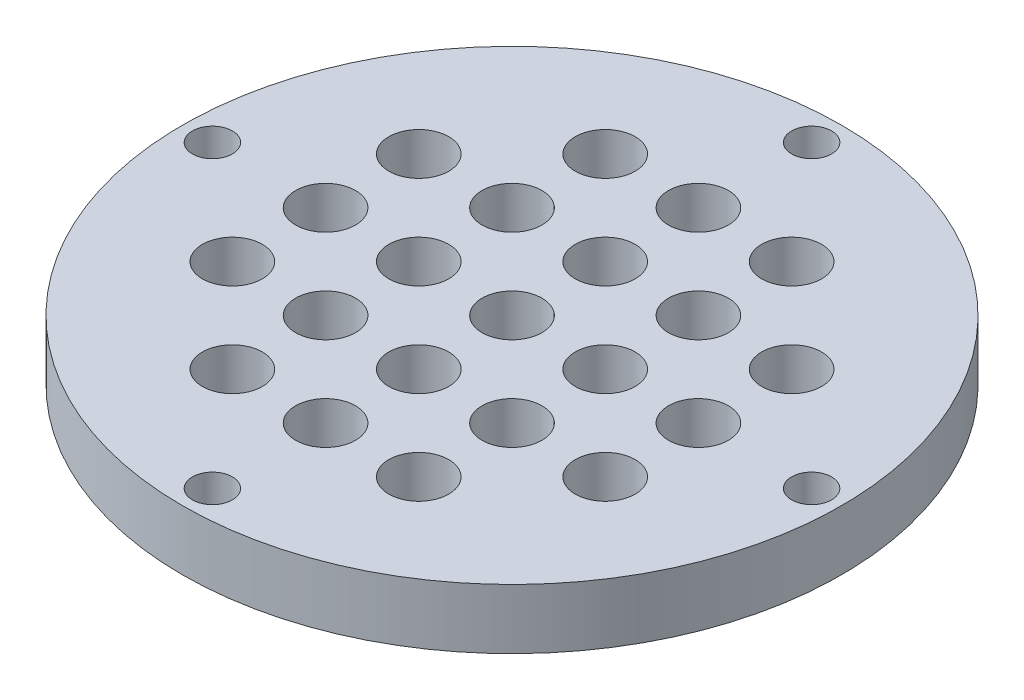
ISO-10303-21;
HEADER;
FILE_DESCRIPTION(('STEP AP214'),'2;1');
FILE_NAME('part.step','',(''),(''),'','','');
FILE_SCHEMA(('AUTOMOTIVE_DESIGN { 1 0 10303 214 1 1 1 1 }'));
ENDSEC;
DATA;
#1=APPLICATION_CONTEXT('core data for automotive mechanical design processes');
#2=APPLICATION_PROTOCOL_DEFINITION('international standard','automotive_design',2000,#1);
#3=PRODUCT_CONTEXT('',#1,'mechanical');
#4=PRODUCT('Part','Part','',(#3));
#5=PRODUCT_RELATED_PRODUCT_CATEGORY('part','',(#4));
#6=PRODUCT_DEFINITION_FORMATION('','',#4);
#7=PRODUCT_DEFINITION_CONTEXT('part definition',#1,'design');
#8=PRODUCT_DEFINITION('design','',#6,#7);
#9=PRODUCT_DEFINITION_SHAPE('','',#8);
#10=(LENGTH_UNIT() NAMED_UNIT(*) SI_UNIT(.MILLI.,.METRE.));
#11=(NAMED_UNIT(*) PLANE_ANGLE_UNIT() SI_UNIT($,.RADIAN.));
#12=(NAMED_UNIT(*) SI_UNIT($,.STERADIAN.) SOLID_ANGLE_UNIT());
#13=UNCERTAINTY_MEASURE_WITH_UNIT(LENGTH_MEASURE(1.E-05),#10,'distance_accuracy_value','');
#14=(GEOMETRIC_REPRESENTATION_CONTEXT(3) GLOBAL_UNCERTAINTY_ASSIGNED_CONTEXT((#13)) GLOBAL_UNIT_ASSIGNED_CONTEXT((#10,
#11,#12)) REPRESENTATION_CONTEXT('',''));
#15=CARTESIAN_POINT('',(0.,0.,0.));
#16=DIRECTION('',(0.,0.,1.));
#17=DIRECTION('',(1.,0.,0.));
#18=AXIS2_PLACEMENT_3D('',#15,#16,#17);
#19=CARTESIAN_POINT('',(0.,3.,0.));
#20=DIRECTION('',(0.,-1.,0.));
#21=DIRECTION('',(0.,0.,-1.));
#22=AXIS2_PLACEMENT_3D('',#19,#20,#21);
#23=CYLINDRICAL_SURFACE('',#22,16.5);
#24=CARTESIAN_POINT('',(0.,3.,0.));
#25=DIRECTION('',(0.,1.,0.));
#26=DIRECTION('',(0.,0.,1.));
#27=AXIS2_PLACEMENT_3D('',#24,#25,#26);
#28=CIRCLE('',#27,16.5);
#29=CARTESIAN_POINT('',(0.,3.,16.5));
#30=VERTEX_POINT('',#29);
#31=EDGE_CURVE('E11',#30,#30,#28,.T.);
#32=ORIENTED_EDGE('',*,*,#31,.F.);
#33=EDGE_LOOP('',(#32));
#34=FACE_BOUND('',#33,.T.);
#35=CARTESIAN_POINT('',(0.,0.,0.));
#36=DIRECTION('',(0.,1.,0.));
#37=DIRECTION('',(0.,0.,1.));
#38=AXIS2_PLACEMENT_3D('',#35,#36,#37);
#39=CIRCLE('',#38,16.5);
#40=CARTESIAN_POINT('',(0.,0.,16.5));
#41=VERTEX_POINT('',#40);
#42=EDGE_CURVE('E54',#41,#41,#39,.T.);
#43=ORIENTED_EDGE('',*,*,#42,.T.);
#44=EDGE_LOOP('',(#43));
#45=FACE_BOUND('',#44,.T.);
#46=ADVANCED_FACE('F47',(#34,#45),#23,.T.);
#47=CARTESIAN_POINT('',(0.,3.,0.));
#48=DIRECTION('',(0.,1.,0.));
#49=DIRECTION('',(0.,0.,1.));
#50=AXIS2_PLACEMENT_3D('',#47,#48,#49);
#51=PLANE('',#50);
#52=CARTESIAN_POINT('',(0.,3.,-9.33381288251492));
#53=DIRECTION('',(0.,1.,0.));
#54=DIRECTION('',(1.,0.,0.));
#55=AXIS2_PLACEMENT_3D('',#52,#53,#54);
#56=CIRCLE('',#55,1.5);
#57=CARTESIAN_POINT('',(1.49999999999998,3.,-9.33381288251492));
#58=VERTEX_POINT('',#57);
#59=EDGE_CURVE('E278',#58,#58,#56,.T.);
#60=ORIENTED_EDGE('',*,*,#59,.F.);
#61=EDGE_LOOP('',(#60));
#62=FACE_BOUND('',#61,.T.);
#63=CARTESIAN_POINT('',(4.66690475583122,3.,4.66690138497872));
#64=DIRECTION('',(0.,1.,0.));
#65=DIRECTION('',(1.,0.,0.));
#66=AXIS2_PLACEMENT_3D('',#63,#64,#65);
#67=CIRCLE('',#66,1.5);
#68=CARTESIAN_POINT('',(6.16690475583122,3.,4.66690138497872));
#69=VERTEX_POINT('',#68);
#70=EDGE_CURVE('E303',#69,#69,#67,.T.);
#71=ORIENTED_EDGE('',*,*,#70,.F.);
#72=EDGE_LOOP('',(#71));
#73=FACE_BOUND('',#72,.T.);
#74=CARTESIAN_POINT('',(-4.66690475583123,3.,-9.33381288251491));
#75=DIRECTION('',(0.,1.,0.));
#76=DIRECTION('',(1.,0.,0.));
#77=AXIS2_PLACEMENT_3D('',#74,#75,#76);
#78=CIRCLE('',#77,1.5);
#79=CARTESIAN_POINT('',(-3.16690475583123,3.,-9.33381288251491));
#80=VERTEX_POINT('',#79);
#81=EDGE_CURVE('E302',#80,#80,#78,.T.);
#82=ORIENTED_EDGE('',*,*,#81,.F.);
#83=EDGE_LOOP('',(#82));
#84=FACE_BOUND('',#83,.T.);
#85=CARTESIAN_POINT('',(4.66690475583121,3.,-3.37085249470237E-06));
#86=DIRECTION('',(0.,1.,0.));
#87=DIRECTION('',(1.,0.,0.));
#88=AXIS2_PLACEMENT_3D('',#85,#86,#87);
#89=CIRCLE('',#88,1.5);
#90=CARTESIAN_POINT('',(6.16690475583121,3.,-3.37085249470237E-06));
#91=VERTEX_POINT('',#90);
#92=EDGE_CURVE('E315',#91,#91,#89,.T.);
#93=ORIENTED_EDGE('',*,*,#92,.F.);
#94=EDGE_LOOP('',(#93));
#95=FACE_BOUND('',#94,.T.);
#96=CARTESIAN_POINT('',(0.,3.,4.66690138497873));
#97=DIRECTION('',(0.,1.,0.));
#98=DIRECTION('',(1.,0.,0.));
#99=AXIS2_PLACEMENT_3D('',#96,#97,#98);
#100=CIRCLE('',#99,1.5);
#101=CARTESIAN_POINT('',(1.50000000000001,3.,4.66690138497873));
#102=VERTEX_POINT('',#101);
#103=EDGE_CURVE('E279',#102,#102,#100,.T.);
#104=ORIENTED_EDGE('',*,*,#103,.F.);
#105=EDGE_LOOP('',(#104));
#106=FACE_BOUND('',#105,.T.);
#107=CARTESIAN_POINT('',(4.6669047558312,3.,-9.33381288251493));
#108=DIRECTION('',(0.,1.,0.));
#109=DIRECTION('',(1.,0.,0.));
#110=AXIS2_PLACEMENT_3D('',#107,#108,#109);
#111=CIRCLE('',#110,1.5);
#112=CARTESIAN_POINT('',(6.1669047558312,3.,-9.33381288251493));
#113=VERTEX_POINT('',#112);
#114=EDGE_CURVE('E285',#113,#113,#111,.T.);
#115=ORIENTED_EDGE('',*,*,#114,.F.);
#116=EDGE_LOOP('',(#115));
#117=FACE_BOUND('',#116,.T.);
#118=CARTESIAN_POINT('',(9.33380951166242,3.,-4.66690812668372));
#119=DIRECTION('',(0.,1.,0.));
#120=DIRECTION('',(1.,0.,0.));
#121=AXIS2_PLACEMENT_3D('',#118,#119,#120);
#122=CIRCLE('',#121,1.5);
#123=CARTESIAN_POINT('',(10.8338095116624,3.,-4.66690812668372));
#124=VERTEX_POINT('',#123);
#125=EDGE_CURVE('E291',#124,#124,#122,.T.);
#126=ORIENTED_EDGE('',*,*,#125,.F.);
#127=EDGE_LOOP('',(#126));
#128=FACE_BOUND('',#127,.T.);
#129=CARTESIAN_POINT('',(9.33380951166243,3.,-3.37085250337599E-06));
#130=DIRECTION('',(0.,1.,0.));
#131=DIRECTION('',(1.,0.,0.));
#132=AXIS2_PLACEMENT_3D('',#129,#130,#131);
#133=CIRCLE('',#132,1.5);
#134=CARTESIAN_POINT('',(10.8338095116624,3.,-3.37085250337599E-06));
#135=VERTEX_POINT('',#134);
#136=EDGE_CURVE('E255',#135,#135,#133,.T.);
#137=ORIENTED_EDGE('',*,*,#136,.F.);
#138=EDGE_LOOP('',(#137));
#139=FACE_BOUND('',#138,.T.);
#140=CARTESIAN_POINT('',(-4.66690475583122,3.,-4.66690812668369));
#141=DIRECTION('',(0.,1.,0.));
#142=DIRECTION('',(1.,0.,0.));
#143=AXIS2_PLACEMENT_3D('',#140,#141,#142);
#144=CIRCLE('',#143,1.5);
#145=CARTESIAN_POINT('',(-3.16690475583122,3.,-4.66690812668369));
#146=VERTEX_POINT('',#145);
#147=EDGE_CURVE('E338',#146,#146,#144,.T.);
#148=ORIENTED_EDGE('',*,*,#147,.F.);
#149=EDGE_LOOP('',(#148));
#150=FACE_BOUND('',#149,.T.);
#151=CARTESIAN_POINT('',(-9.33380951166242,3.,4.66690138497874));
#152=DIRECTION('',(0.,1.,0.));
#153=DIRECTION('',(1.,0.,0.));
#154=AXIS2_PLACEMENT_3D('',#151,#152,#153);
#155=CIRCLE('',#154,1.5);
#156=CARTESIAN_POINT('',(-7.83380951166242,3.,4.66690138497874));
#157=VERTEX_POINT('',#156);
#158=EDGE_CURVE('E351',#157,#157,#155,.T.);
#159=ORIENTED_EDGE('',*,*,#158,.F.);
#160=EDGE_LOOP('',(#159));
#161=FACE_BOUND('',#160,.T.);
#162=CARTESIAN_POINT('',(-4.66690475583121,3.,-3.3708524782225E-06));
#163=DIRECTION('',(0.,1.,0.));
#164=DIRECTION('',(1.,0.,0.));
#165=AXIS2_PLACEMENT_3D('',#162,#163,#164);
#166=CIRCLE('',#165,1.5);
#167=CARTESIAN_POINT('',(-3.16690475583121,3.,-3.3708524782225E-06));
#168=VERTEX_POINT('',#167);
#169=EDGE_CURVE('E350',#168,#168,#166,.T.);
#170=ORIENTED_EDGE('',*,*,#169,.F.);
#171=EDGE_LOOP('',(#170));
#172=FACE_BOUND('',#171,.T.);
#173=CARTESIAN_POINT('',(-4.66690475583121,3.,4.66690138497874));
#174=DIRECTION('',(0.,1.,0.));
#175=DIRECTION('',(1.,0.,0.));
#176=AXIS2_PLACEMENT_3D('',#173,#174,#175);
#177=CIRCLE('',#176,1.5);
#178=CARTESIAN_POINT('',(-3.16690475583121,3.,4.66690138497874));
#179=VERTEX_POINT('',#178);
#180=EDGE_CURVE('E363',#179,#179,#177,.T.);
#181=ORIENTED_EDGE('',*,*,#180,.F.);
#182=EDGE_LOOP('',(#181));
#183=FACE_BOUND('',#182,.T.);
#184=CARTESIAN_POINT('',(4.66690475583121,3.,-4.66690812668371));
#185=DIRECTION('',(0.,1.,0.));
#186=DIRECTION('',(1.,0.,0.));
#187=AXIS2_PLACEMENT_3D('',#184,#185,#186);
#188=CIRCLE('',#187,1.5);
#189=CARTESIAN_POINT('',(6.16690475583121,3.,-4.66690812668371));
#190=VERTEX_POINT('',#189);
#191=EDGE_CURVE('E314',#190,#190,#188,.T.);
#192=ORIENTED_EDGE('',*,*,#191,.F.);
#193=EDGE_LOOP('',(#192));
#194=FACE_BOUND('',#193,.T.);
#195=CARTESIAN_POINT('',(-9.33380951166243,3.,-4.66690812668368));
#196=DIRECTION('',(0.,1.,0.));
#197=DIRECTION('',(1.,0.,0.));
#198=AXIS2_PLACEMENT_3D('',#195,#196,#197);
#199=CIRCLE('',#198,1.5);
#200=CARTESIAN_POINT('',(-7.83380951166243,3.,-4.66690812668368));
#201=VERTEX_POINT('',#200);
#202=EDGE_CURVE('E327',#201,#201,#199,.T.);
#203=ORIENTED_EDGE('',*,*,#202,.F.);
#204=EDGE_LOOP('',(#203));
#205=FACE_BOUND('',#204,.T.);
#206=CARTESIAN_POINT('',(0.,3.,-4.6669081266837));
#207=DIRECTION('',(0.,1.,0.));
#208=DIRECTION('',(1.,0.,0.));
#209=AXIS2_PLACEMENT_3D('',#206,#207,#208);
#210=CIRCLE('',#209,1.5);
#211=CARTESIAN_POINT('',(1.49999999999999,3.,-4.6669081266837));
#212=VERTEX_POINT('',#211);
#213=EDGE_CURVE('E326',#212,#212,#210,.T.);
#214=ORIENTED_EDGE('',*,*,#213,.F.);
#215=EDGE_LOOP('',(#214));
#216=FACE_BOUND('',#215,.T.);
#217=CARTESIAN_POINT('',(-9.33380951166243,3.,-3.37085247041624E-06));
#218=DIRECTION('',(0.,1.,0.));
#219=DIRECTION('',(1.,0.,0.));
#220=AXIS2_PLACEMENT_3D('',#217,#218,#219);
#221=CIRCLE('',#220,1.5);
#222=CARTESIAN_POINT('',(-7.83380951166243,3.,-3.37085247041624E-06));
#223=VERTEX_POINT('',#222);
#224=EDGE_CURVE('E339',#223,#223,#221,.T.);
#225=ORIENTED_EDGE('',*,*,#224,.F.);
#226=EDGE_LOOP('',(#225));
#227=FACE_BOUND('',#226,.T.);
#228=CARTESIAN_POINT('',(9.33380951166244,3.,4.66690138497871));
#229=DIRECTION('',(0.,1.,0.));
#230=DIRECTION('',(1.,0.,0.));
#231=AXIS2_PLACEMENT_3D('',#228,#229,#230);
#232=CIRCLE('',#231,1.5);
#233=CARTESIAN_POINT('',(10.8338095116624,3.,4.66690138497871));
#234=VERTEX_POINT('',#233);
#235=EDGE_CURVE('E251',#234,#234,#232,.T.);
#236=ORIENTED_EDGE('',*,*,#235,.F.);
#237=EDGE_LOOP('',(#236));
#238=FACE_BOUND('',#237,.T.);
#239=CARTESIAN_POINT('',(4.66690475583123,3.,9.33380614080993));
#240=DIRECTION('',(0.,1.,0.));
#241=DIRECTION('',(1.,0.,0.));
#242=AXIS2_PLACEMENT_3D('',#239,#240,#241);
#243=CIRCLE('',#242,1.5);
#244=CARTESIAN_POINT('',(6.16690475583123,3.,9.33380614080993));
#245=VERTEX_POINT('',#244);
#246=EDGE_CURVE('E258',#245,#245,#243,.T.);
#247=ORIENTED_EDGE('',*,*,#246,.F.);
#248=EDGE_LOOP('',(#247));
#249=FACE_BOUND('',#248,.T.);
#250=CARTESIAN_POINT('',(0.,3.,9.33380614080994));
#251=DIRECTION('',(0.,1.,0.));
#252=DIRECTION('',(1.,0.,0.));
#253=AXIS2_PLACEMENT_3D('',#250,#251,#252);
#254=CIRCLE('',#253,1.5);
#255=CARTESIAN_POINT('',(1.50000000000002,3.,9.33380614080994));
#256=VERTEX_POINT('',#255);
#257=EDGE_CURVE('E266',#256,#256,#254,.T.);
#258=ORIENTED_EDGE('',*,*,#257,.F.);
#259=EDGE_LOOP('',(#258));
#260=FACE_BOUND('',#259,.T.);
#261=CARTESIAN_POINT('',(-4.6669047558312,3.,9.33380614080995));
#262=DIRECTION('',(0.,1.,0.));
#263=DIRECTION('',(1.,0.,0.));
#264=AXIS2_PLACEMENT_3D('',#261,#262,#263);
#265=CIRCLE('',#264,1.5);
#266=CARTESIAN_POINT('',(-3.1669047558312,3.,9.33380614080995));
#267=VERTEX_POINT('',#266);
#268=EDGE_CURVE('E272',#267,#267,#265,.T.);
#269=ORIENTED_EDGE('',*,*,#268,.F.);
#270=EDGE_LOOP('',(#269));
#271=FACE_BOUND('',#270,.T.);
#272=CARTESIAN_POINT('',(0.,3.,-3.37085248602875E-06));
#273=DIRECTION('',(0.,1.,0.));
#274=DIRECTION('',(1.,0.,0.));
#275=AXIS2_PLACEMENT_3D('',#272,#273,#274);
#276=CIRCLE('',#275,1.5);
#277=CARTESIAN_POINT('',(1.5,3.,-3.37085248602875E-06));
#278=VERTEX_POINT('',#277);
#279=EDGE_CURVE('E362',#278,#278,#276,.T.);
#280=ORIENTED_EDGE('',*,*,#279,.F.);
#281=EDGE_LOOP('',(#280));
#282=FACE_BOUND('',#281,.T.);
#283=CARTESIAN_POINT('',(0.,3.,15.));
#284=DIRECTION('',(0.,1.,0.));
#285=DIRECTION('',(-1.,0.,0.));
#286=AXIS2_PLACEMENT_3D('',#283,#284,#285);
#287=CIRCLE('',#286,1.);
#288=CARTESIAN_POINT('',(-1.00000000000006,3.,15.));
#289=VERTEX_POINT('',#288);
#290=EDGE_CURVE('E386',#289,#289,#287,.T.);
#291=ORIENTED_EDGE('',*,*,#290,.F.);
#292=EDGE_LOOP('',(#291));
#293=FACE_BOUND('',#292,.T.);
#294=CARTESIAN_POINT('',(-15.,3.,0.));
#295=DIRECTION('',(0.,1.,0.));
#296=DIRECTION('',(0.,0.,-1.));
#297=AXIS2_PLACEMENT_3D('',#294,#295,#296);
#298=CIRCLE('',#297,1.);
#299=CARTESIAN_POINT('',(-15.,3.,-1.));
#300=VERTEX_POINT('',#299);
#301=EDGE_CURVE('E86',#300,#300,#298,.T.);
#302=ORIENTED_EDGE('',*,*,#301,.F.);
#303=EDGE_LOOP('',(#302));
#304=FACE_BOUND('',#303,.T.);
#305=CARTESIAN_POINT('',(1.57116660247941E-13,3.,-15.));
#306=DIRECTION('',(0.,1.,0.));
#307=DIRECTION('',(1.,0.,0.));
#308=AXIS2_PLACEMENT_3D('',#305,#306,#307);
#309=CIRCLE('',#308,1.);
#310=CARTESIAN_POINT('',(1.00000000000016,3.,-15.));
#311=VERTEX_POINT('',#310);
#312=EDGE_CURVE('E77',#311,#311,#309,.T.);
#313=ORIENTED_EDGE('',*,*,#312,.F.);
#314=EDGE_LOOP('',(#313));
#315=FACE_BOUND('',#314,.T.);
#316=CARTESIAN_POINT('',(15.,3.,0.));
#317=DIRECTION('',(0.,1.,0.));
#318=DIRECTION('',(0.,0.,1.));
#319=AXIS2_PLACEMENT_3D('',#316,#317,#318);
#320=CIRCLE('',#319,1.);
#321=CARTESIAN_POINT('',(15.,3.,1.));
#322=VERTEX_POINT('',#321);
#323=EDGE_CURVE('E62',#322,#322,#320,.T.);
#324=ORIENTED_EDGE('',*,*,#323,.F.);
#325=EDGE_LOOP('',(#324));
#326=FACE_BOUND('',#325,.T.);
#327=ORIENTED_EDGE('',*,*,#31,.T.);
#328=EDGE_LOOP('',(#327));
#329=FACE_BOUND('',#328,.T.);
#330=ADVANCED_FACE('F100',(#62,#73,#84,#95,#106,#117,#128,#139,#150,#161,#172,#183,#194,#205,
#216,#227,#238,#249,#260,#271,#282,#293,#304,#315,#326,#329),#51,.T.);
#331=CARTESIAN_POINT('',(0.,0.,0.));
#332=DIRECTION('',(0.,1.,0.));
#333=DIRECTION('',(0.,0.,1.));
#334=AXIS2_PLACEMENT_3D('',#331,#332,#333);
#335=PLANE('',#334);
#336=CARTESIAN_POINT('',(0.,0.,-9.33381288251492));
#337=DIRECTION('',(0.,1.,0.));
#338=DIRECTION('',(1.,0.,0.));
#339=AXIS2_PLACEMENT_3D('',#336,#337,#338);
#340=CIRCLE('',#339,1.5);
#341=CARTESIAN_POINT('',(1.49999999999998,0.,-9.33381288251492));
#342=VERTEX_POINT('',#341);
#343=EDGE_CURVE('E306',#342,#342,#340,.T.);
#344=ORIENTED_EDGE('',*,*,#343,.T.);
#345=EDGE_LOOP('',(#344));
#346=FACE_BOUND('',#345,.T.);
#347=CARTESIAN_POINT('',(4.66690475583122,0.,4.66690138497872));
#348=DIRECTION('',(0.,1.,0.));
#349=DIRECTION('',(1.,0.,0.));
#350=AXIS2_PLACEMENT_3D('',#347,#348,#349);
#351=CIRCLE('',#350,1.5);
#352=CARTESIAN_POINT('',(6.16690475583122,0.,4.66690138497872));
#353=VERTEX_POINT('',#352);
#354=EDGE_CURVE('E299',#353,#353,#351,.T.);
#355=ORIENTED_EDGE('',*,*,#354,.T.);
#356=EDGE_LOOP('',(#355));
#357=FACE_BOUND('',#356,.T.);
#358=CARTESIAN_POINT('',(-4.66690475583123,0.,-9.33381288251491));
#359=DIRECTION('',(0.,1.,0.));
#360=DIRECTION('',(1.,0.,0.));
#361=AXIS2_PLACEMENT_3D('',#358,#359,#360);
#362=CIRCLE('',#361,1.5);
#363=CARTESIAN_POINT('',(-3.16690475583123,0.,-9.33381288251491));
#364=VERTEX_POINT('',#363);
#365=EDGE_CURVE('E318',#364,#364,#362,.T.);
#366=ORIENTED_EDGE('',*,*,#365,.T.);
#367=EDGE_LOOP('',(#366));
#368=FACE_BOUND('',#367,.T.);
#369=CARTESIAN_POINT('',(4.66690475583121,0.,-3.37085249470237E-06));
#370=DIRECTION('',(0.,1.,0.));
#371=DIRECTION('',(1.,0.,0.));
#372=AXIS2_PLACEMENT_3D('',#369,#370,#371);
#373=CIRCLE('',#372,1.5);
#374=CARTESIAN_POINT('',(6.16690475583121,0.,-3.37085249470237E-06));
#375=VERTEX_POINT('',#374);
#376=EDGE_CURVE('E311',#375,#375,#373,.T.);
#377=ORIENTED_EDGE('',*,*,#376,.T.);
#378=EDGE_LOOP('',(#377));
#379=FACE_BOUND('',#378,.T.);
#380=CARTESIAN_POINT('',(0.,0.,4.66690138497873));
#381=DIRECTION('',(0.,1.,0.));
#382=DIRECTION('',(1.,0.,0.));
#383=AXIS2_PLACEMENT_3D('',#380,#381,#382);
#384=CIRCLE('',#383,1.5);
#385=CARTESIAN_POINT('',(1.50000000000001,0.,4.66690138497873));
#386=VERTEX_POINT('',#385);
#387=EDGE_CURVE('E275',#386,#386,#384,.T.);
#388=ORIENTED_EDGE('',*,*,#387,.T.);
#389=EDGE_LOOP('',(#388));
#390=FACE_BOUND('',#389,.T.);
#391=CARTESIAN_POINT('',(4.6669047558312,0.,-9.33381288251493));
#392=DIRECTION('',(0.,1.,0.));
#393=DIRECTION('',(1.,0.,0.));
#394=AXIS2_PLACEMENT_3D('',#391,#392,#393);
#395=CIRCLE('',#394,1.5);
#396=CARTESIAN_POINT('',(6.1669047558312,0.,-9.33381288251493));
#397=VERTEX_POINT('',#396);
#398=EDGE_CURVE('E282',#397,#397,#395,.T.);
#399=ORIENTED_EDGE('',*,*,#398,.T.);
#400=EDGE_LOOP('',(#399));
#401=FACE_BOUND('',#400,.T.);
#402=CARTESIAN_POINT('',(9.33380951166242,0.,-4.66690812668372));
#403=DIRECTION('',(0.,1.,0.));
#404=DIRECTION('',(1.,0.,0.));
#405=AXIS2_PLACEMENT_3D('',#402,#403,#404);
#406=CIRCLE('',#405,1.5);
#407=CARTESIAN_POINT('',(10.8338095116624,0.,-4.66690812668372));
#408=VERTEX_POINT('',#407);
#409=EDGE_CURVE('E288',#408,#408,#406,.T.);
#410=ORIENTED_EDGE('',*,*,#409,.T.);
#411=EDGE_LOOP('',(#410));
#412=FACE_BOUND('',#411,.T.);
#413=CARTESIAN_POINT('',(9.33380951166243,0.,-3.37085250337599E-06));
#414=DIRECTION('',(0.,1.,0.));
#415=DIRECTION('',(1.,0.,0.));
#416=AXIS2_PLACEMENT_3D('',#413,#414,#415);
#417=CIRCLE('',#416,1.5);
#418=CARTESIAN_POINT('',(10.8338095116624,0.,-3.37085250337599E-06));
#419=VERTEX_POINT('',#418);
#420=EDGE_CURVE('E294',#419,#419,#417,.T.);
#421=ORIENTED_EDGE('',*,*,#420,.T.);
#422=EDGE_LOOP('',(#421));
#423=FACE_BOUND('',#422,.T.);
#424=CARTESIAN_POINT('',(-4.66690475583122,0.,-4.66690812668369));
#425=DIRECTION('',(0.,1.,0.));
#426=DIRECTION('',(1.,0.,0.));
#427=AXIS2_PLACEMENT_3D('',#424,#425,#426);
#428=CIRCLE('',#427,1.5);
#429=CARTESIAN_POINT('',(-3.16690475583122,0.,-4.66690812668369));
#430=VERTEX_POINT('',#429);
#431=EDGE_CURVE('E354',#430,#430,#428,.T.);
#432=ORIENTED_EDGE('',*,*,#431,.T.);
#433=EDGE_LOOP('',(#432));
#434=FACE_BOUND('',#433,.T.);
#435=CARTESIAN_POINT('',(-9.33380951166242,0.,4.66690138497874));
#436=DIRECTION('',(0.,1.,0.));
#437=DIRECTION('',(1.,0.,0.));
#438=AXIS2_PLACEMENT_3D('',#435,#436,#437);
#439=CIRCLE('',#438,1.5);
#440=CARTESIAN_POINT('',(-7.83380951166242,0.,4.66690138497874));
#441=VERTEX_POINT('',#440);
#442=EDGE_CURVE('E347',#441,#441,#439,.T.);
#443=ORIENTED_EDGE('',*,*,#442,.T.);
#444=EDGE_LOOP('',(#443));
#445=FACE_BOUND('',#444,.T.);
#446=CARTESIAN_POINT('',(-4.66690475583121,0.,-3.3708524782225E-06));
#447=DIRECTION('',(0.,1.,0.));
#448=DIRECTION('',(1.,0.,0.));
#449=AXIS2_PLACEMENT_3D('',#446,#447,#448);
#450=CIRCLE('',#449,1.5);
#451=CARTESIAN_POINT('',(-3.16690475583121,0.,-3.3708524782225E-06));
#452=VERTEX_POINT('',#451);
#453=EDGE_CURVE('E366',#452,#452,#450,.T.);
#454=ORIENTED_EDGE('',*,*,#453,.T.);
#455=EDGE_LOOP('',(#454));
#456=FACE_BOUND('',#455,.T.);
#457=CARTESIAN_POINT('',(-4.66690475583121,0.,4.66690138497874));
#458=DIRECTION('',(0.,1.,0.));
#459=DIRECTION('',(1.,0.,0.));
#460=AXIS2_PLACEMENT_3D('',#457,#458,#459);
#461=CIRCLE('',#460,1.5);
#462=CARTESIAN_POINT('',(-3.16690475583121,0.,4.66690138497874));
#463=VERTEX_POINT('',#462);
#464=EDGE_CURVE('E359',#463,#463,#461,.T.);
#465=ORIENTED_EDGE('',*,*,#464,.T.);
#466=EDGE_LOOP('',(#465));
#467=FACE_BOUND('',#466,.T.);
#468=CARTESIAN_POINT('',(4.66690475583121,0.,-4.66690812668371));
#469=DIRECTION('',(0.,1.,0.));
#470=DIRECTION('',(1.,0.,0.));
#471=AXIS2_PLACEMENT_3D('',#468,#469,#470);
#472=CIRCLE('',#471,1.5);
#473=CARTESIAN_POINT('',(6.16690475583121,0.,-4.66690812668371));
#474=VERTEX_POINT('',#473);
#475=EDGE_CURVE('E330',#474,#474,#472,.T.);
#476=ORIENTED_EDGE('',*,*,#475,.T.);
#477=EDGE_LOOP('',(#476));
#478=FACE_BOUND('',#477,.T.);
#479=CARTESIAN_POINT('',(-9.33380951166243,0.,-4.66690812668368));
#480=DIRECTION('',(0.,1.,0.));
#481=DIRECTION('',(1.,0.,0.));
#482=AXIS2_PLACEMENT_3D('',#479,#480,#481);
#483=CIRCLE('',#482,1.5);
#484=CARTESIAN_POINT('',(-7.83380951166243,0.,-4.66690812668368));
#485=VERTEX_POINT('',#484);
#486=EDGE_CURVE('E323',#485,#485,#483,.T.);
#487=ORIENTED_EDGE('',*,*,#486,.T.);
#488=EDGE_LOOP('',(#487));
#489=FACE_BOUND('',#488,.T.);
#490=CARTESIAN_POINT('',(0.,0.,-4.6669081266837));
#491=DIRECTION('',(0.,1.,0.));
#492=DIRECTION('',(1.,0.,0.));
#493=AXIS2_PLACEMENT_3D('',#490,#491,#492);
#494=CIRCLE('',#493,1.5);
#495=CARTESIAN_POINT('',(1.49999999999999,0.,-4.6669081266837));
#496=VERTEX_POINT('',#495);
#497=EDGE_CURVE('E342',#496,#496,#494,.T.);
#498=ORIENTED_EDGE('',*,*,#497,.T.);
#499=EDGE_LOOP('',(#498));
#500=FACE_BOUND('',#499,.T.);
#501=CARTESIAN_POINT('',(-9.33380951166243,0.,-3.37085247041624E-06));
#502=DIRECTION('',(0.,1.,0.));
#503=DIRECTION('',(1.,0.,0.));
#504=AXIS2_PLACEMENT_3D('',#501,#502,#503);
#505=CIRCLE('',#504,1.5);
#506=CARTESIAN_POINT('',(-7.83380951166243,0.,-3.37085247041624E-06));
#507=VERTEX_POINT('',#506);
#508=EDGE_CURVE('E335',#507,#507,#505,.T.);
#509=ORIENTED_EDGE('',*,*,#508,.T.);
#510=EDGE_LOOP('',(#509));
#511=FACE_BOUND('',#510,.T.);
#512=CARTESIAN_POINT('',(9.33380951166244,0.,4.66690138497871));
#513=DIRECTION('',(0.,1.,0.));
#514=DIRECTION('',(1.,0.,0.));
#515=AXIS2_PLACEMENT_3D('',#512,#513,#514);
#516=CIRCLE('',#515,1.5);
#517=CARTESIAN_POINT('',(10.8338095116624,0.,4.66690138497871));
#518=VERTEX_POINT('',#517);
#519=EDGE_CURVE('E248',#518,#518,#516,.T.);
#520=ORIENTED_EDGE('',*,*,#519,.T.);
#521=EDGE_LOOP('',(#520));
#522=FACE_BOUND('',#521,.T.);
#523=CARTESIAN_POINT('',(4.66690475583123,0.,9.33380614080993));
#524=DIRECTION('',(0.,1.,0.));
#525=DIRECTION('',(1.,0.,0.));
#526=AXIS2_PLACEMENT_3D('',#523,#524,#525);
#527=CIRCLE('',#526,1.5);
#528=CARTESIAN_POINT('',(6.16690475583123,0.,9.33380614080993));
#529=VERTEX_POINT('',#528);
#530=EDGE_CURVE('E253',#529,#529,#527,.T.);
#531=ORIENTED_EDGE('',*,*,#530,.T.);
#532=EDGE_LOOP('',(#531));
#533=FACE_BOUND('',#532,.T.);
#534=CARTESIAN_POINT('',(0.,0.,9.33380614080994));
#535=DIRECTION('',(0.,1.,0.));
#536=DIRECTION('',(1.,0.,0.));
#537=AXIS2_PLACEMENT_3D('',#534,#535,#536);
#538=CIRCLE('',#537,1.5);
#539=CARTESIAN_POINT('',(1.50000000000002,0.,9.33380614080994));
#540=VERTEX_POINT('',#539);
#541=EDGE_CURVE('E263',#540,#540,#538,.T.);
#542=ORIENTED_EDGE('',*,*,#541,.T.);
#543=EDGE_LOOP('',(#542));
#544=FACE_BOUND('',#543,.T.);
#545=CARTESIAN_POINT('',(-4.6669047558312,0.,9.33380614080995));
#546=DIRECTION('',(0.,1.,0.));
#547=DIRECTION('',(1.,0.,0.));
#548=AXIS2_PLACEMENT_3D('',#545,#546,#547);
#549=CIRCLE('',#548,1.5);
#550=CARTESIAN_POINT('',(-3.1669047558312,0.,9.33380614080995));
#551=VERTEX_POINT('',#550);
#552=EDGE_CURVE('E269',#551,#551,#549,.T.);
#553=ORIENTED_EDGE('',*,*,#552,.T.);
#554=EDGE_LOOP('',(#553));
#555=FACE_BOUND('',#554,.T.);
#556=CARTESIAN_POINT('',(0.,0.,-3.37085248602875E-06));
#557=DIRECTION('',(0.,1.,0.));
#558=DIRECTION('',(1.,0.,0.));
#559=AXIS2_PLACEMENT_3D('',#556,#557,#558);
#560=CIRCLE('',#559,1.5);
#561=CARTESIAN_POINT('',(1.5,0.,-3.37085248602875E-06));
#562=VERTEX_POINT('',#561);
#563=EDGE_CURVE('E371',#562,#562,#560,.T.);
#564=ORIENTED_EDGE('',*,*,#563,.T.);
#565=EDGE_LOOP('',(#564));
#566=FACE_BOUND('',#565,.T.);
#567=CARTESIAN_POINT('',(0.,0.,15.));
#568=DIRECTION('',(0.,1.,0.));
#569=DIRECTION('',(-1.,0.,0.));
#570=AXIS2_PLACEMENT_3D('',#567,#568,#569);
#571=CIRCLE('',#570,0.6);
#572=CARTESIAN_POINT('',(-0.600000000000052,0.,15.));
#573=VERTEX_POINT('',#572);
#574=EDGE_CURVE('E72',#573,#573,#571,.T.);
#575=ORIENTED_EDGE('',*,*,#574,.T.);
#576=EDGE_LOOP('',(#575));
#577=FACE_BOUND('',#576,.T.);
#578=CARTESIAN_POINT('',(-15.,0.,0.));
#579=DIRECTION('',(0.,1.,0.));
#580=DIRECTION('',(0.,0.,-1.));
#581=AXIS2_PLACEMENT_3D('',#578,#579,#580);
#582=CIRCLE('',#581,0.6);
#583=CARTESIAN_POINT('',(-15.,0.,-0.6));
#584=VERTEX_POINT('',#583);
#585=EDGE_CURVE('E379',#584,#584,#582,.T.);
#586=ORIENTED_EDGE('',*,*,#585,.T.);
#587=EDGE_LOOP('',(#586));
#588=FACE_BOUND('',#587,.T.);
#589=CARTESIAN_POINT('',(1.57116660247941E-13,0.,-15.));
#590=DIRECTION('',(0.,1.,0.));
#591=DIRECTION('',(1.,0.,0.));
#592=AXIS2_PLACEMENT_3D('',#589,#590,#591);
#593=CIRCLE('',#592,0.6);
#594=CARTESIAN_POINT('',(0.600000000000157,0.,-15.));
#595=VERTEX_POINT('',#594);
#596=EDGE_CURVE('E374',#595,#595,#593,.T.);
#597=ORIENTED_EDGE('',*,*,#596,.T.);
#598=EDGE_LOOP('',(#597));
#599=FACE_BOUND('',#598,.T.);
#600=CARTESIAN_POINT('',(15.,0.,0.));
#601=DIRECTION('',(0.,1.,0.));
#602=DIRECTION('',(0.,0.,1.));
#603=AXIS2_PLACEMENT_3D('',#600,#601,#602);
#604=CIRCLE('',#603,0.6);
#605=CARTESIAN_POINT('',(15.,0.,0.6));
#606=VERTEX_POINT('',#605);
#607=EDGE_CURVE('E68',#606,#606,#604,.T.);
#608=ORIENTED_EDGE('',*,*,#607,.T.);
#609=EDGE_LOOP('',(#608));
#610=FACE_BOUND('',#609,.T.);
#611=ORIENTED_EDGE('',*,*,#42,.F.);
#612=EDGE_LOOP('',(#611));
#613=FACE_BOUND('',#612,.T.);
#614=ADVANCED_FACE('F102',(#346,#357,#368,#379,#390,#401,#412,#423,#434,#445,#456,#467,#478,
#489,#500,#511,#522,#533,#544,#555,#566,#577,#588,#599,#610,#613),#335,.F.);
#615=CARTESIAN_POINT('',(15.,1.5,0.));
#616=DIRECTION('',(0.,1.,0.));
#617=DIRECTION('',(0.,0.,1.));
#618=AXIS2_PLACEMENT_3D('',#615,#616,#617);
#619=CYLINDRICAL_SURFACE('',#618,1.);
#620=CARTESIAN_POINT('',(15.,1.5,0.));
#621=DIRECTION('',(0.,1.,0.));
#622=DIRECTION('',(0.,0.,1.));
#623=AXIS2_PLACEMENT_3D('',#620,#621,#622);
#624=CIRCLE('',#623,1.);
#625=CARTESIAN_POINT('',(15.,1.5,1.));
#626=VERTEX_POINT('',#625);
#627=EDGE_CURVE('E59',#626,#626,#624,.T.);
#628=ORIENTED_EDGE('',*,*,#627,.F.);
#629=EDGE_LOOP('',(#628));
#630=FACE_BOUND('',#629,.T.);
#631=ORIENTED_EDGE('',*,*,#323,.T.);
#632=EDGE_LOOP('',(#631));
#633=FACE_BOUND('',#632,.T.);
#634=ADVANCED_FACE('F98',(#630,#633),#619,.F.);
#635=CARTESIAN_POINT('',(15.,1.5,0.));
#636=DIRECTION('',(0.,1.,0.));
#637=DIRECTION('',(0.,0.,1.));
#638=AXIS2_PLACEMENT_3D('',#635,#636,#637);
#639=PLANE('',#638);
#640=CARTESIAN_POINT('',(15.,1.5,0.));
#641=DIRECTION('',(0.,1.,0.));
#642=DIRECTION('',(0.,0.,1.));
#643=AXIS2_PLACEMENT_3D('',#640,#641,#642);
#644=CIRCLE('',#643,0.6);
#645=CARTESIAN_POINT('',(15.,1.5,0.6));
#646=VERTEX_POINT('',#645);
#647=EDGE_CURVE('E65',#646,#646,#644,.T.);
#648=ORIENTED_EDGE('',*,*,#647,.F.);
#649=EDGE_LOOP('',(#648));
#650=FACE_BOUND('',#649,.T.);
#651=ORIENTED_EDGE('',*,*,#627,.T.);
#652=EDGE_LOOP('',(#651));
#653=FACE_BOUND('',#652,.T.);
#654=ADVANCED_FACE('F117',(#650,#653),#639,.T.);
#655=CARTESIAN_POINT('',(15.,0.,0.));
#656=DIRECTION('',(0.,1.,0.));
#657=DIRECTION('',(0.,0.,1.));
#658=AXIS2_PLACEMENT_3D('',#655,#656,#657);
#659=CYLINDRICAL_SURFACE('',#658,0.6);
#660=ORIENTED_EDGE('',*,*,#647,.T.);
#661=EDGE_LOOP('',(#660));
#662=FACE_BOUND('',#661,.T.);
#663=ORIENTED_EDGE('',*,*,#607,.F.);
#664=EDGE_LOOP('',(#663));
#665=FACE_BOUND('',#664,.T.);
#666=ADVANCED_FACE('F121',(#662,#665),#659,.F.);
#667=CARTESIAN_POINT('',(1.57116660247941E-13,1.5,-15.));
#668=DIRECTION('',(0.,1.,0.));
#669=DIRECTION('',(0.,0.,1.));
#670=AXIS2_PLACEMENT_3D('',#667,#668,#669);
#671=CYLINDRICAL_SURFACE('',#670,1.);
#672=CARTESIAN_POINT('',(1.57116660247941E-13,1.5,-15.));
#673=DIRECTION('',(0.,1.,0.));
#674=DIRECTION('',(1.,0.,0.));
#675=AXIS2_PLACEMENT_3D('',#672,#673,#674);
#676=CIRCLE('',#675,1.);
#677=CARTESIAN_POINT('',(1.00000000000016,1.5,-15.));
#678=VERTEX_POINT('',#677);
#679=EDGE_CURVE('E81',#678,#678,#676,.T.);
#680=ORIENTED_EDGE('',*,*,#679,.F.);
#681=EDGE_LOOP('',(#680));
#682=FACE_BOUND('',#681,.T.);
#683=ORIENTED_EDGE('',*,*,#312,.T.);
#684=EDGE_LOOP('',(#683));
#685=FACE_BOUND('',#684,.T.);
#686=ADVANCED_FACE('F125',(#682,#685),#671,.F.);
#687=CARTESIAN_POINT('',(1.57116660247941E-13,1.5,-15.));
#688=DIRECTION('',(0.,1.,0.));
#689=DIRECTION('',(1.,0.,0.));
#690=AXIS2_PLACEMENT_3D('',#687,#688,#689);
#691=PLANE('',#690);
#692=CARTESIAN_POINT('',(1.57116660247941E-13,1.5,-15.));
#693=DIRECTION('',(0.,1.,0.));
#694=DIRECTION('',(0.,0.,1.));
#695=AXIS2_PLACEMENT_3D('',#692,#693,#694);
#696=CIRCLE('',#695,0.6);
#697=CARTESIAN_POINT('',(1.57116660247941E-13,1.5,-14.4));
#698=VERTEX_POINT('',#697);
#699=EDGE_CURVE('E50',#698,#698,#696,.T.);
#700=ORIENTED_EDGE('',*,*,#699,.F.);
#701=EDGE_LOOP('',(#700));
#702=FACE_BOUND('',#701,.T.);
#703=ORIENTED_EDGE('',*,*,#679,.T.);
#704=EDGE_LOOP('',(#703));
#705=FACE_BOUND('',#704,.T.);
#706=ADVANCED_FACE('F129',(#702,#705),#691,.T.);
#707=CARTESIAN_POINT('',(-15.,1.5,0.));
#708=DIRECTION('',(0.,1.,0.));
#709=DIRECTION('',(0.,0.,1.));
#710=AXIS2_PLACEMENT_3D('',#707,#708,#709);
#711=CYLINDRICAL_SURFACE('',#710,1.);
#712=CARTESIAN_POINT('',(-15.,1.5,0.));
#713=DIRECTION('',(0.,1.,0.));
#714=DIRECTION('',(0.,0.,-1.));
#715=AXIS2_PLACEMENT_3D('',#712,#713,#714);
#716=CIRCLE('',#715,1.);
#717=CARTESIAN_POINT('',(-15.,1.5,-1.));
#718=VERTEX_POINT('',#717);
#719=EDGE_CURVE('E389',#718,#718,#716,.T.);
#720=ORIENTED_EDGE('',*,*,#719,.F.);
#721=EDGE_LOOP('',(#720));
#722=FACE_BOUND('',#721,.T.);
#723=ORIENTED_EDGE('',*,*,#301,.T.);
#724=EDGE_LOOP('',(#723));
#725=FACE_BOUND('',#724,.T.);
#726=ADVANCED_FACE('F133',(#722,#725),#711,.F.);
#727=CARTESIAN_POINT('',(-15.,1.5,0.));
#728=DIRECTION('',(0.,1.,0.));
#729=DIRECTION('',(0.,0.,-1.));
#730=AXIS2_PLACEMENT_3D('',#727,#728,#729);
#731=PLANE('',#730);
#732=CARTESIAN_POINT('',(-15.,1.5,0.));
#733=DIRECTION('',(0.,1.,0.));
#734=DIRECTION('',(0.,0.,1.));
#735=AXIS2_PLACEMENT_3D('',#732,#733,#734);
#736=CIRCLE('',#735,0.6);
#737=CARTESIAN_POINT('',(-15.,1.5,0.6));
#738=VERTEX_POINT('',#737);
#739=EDGE_CURVE('E71',#738,#738,#736,.T.);
#740=ORIENTED_EDGE('',*,*,#739,.F.);
#741=EDGE_LOOP('',(#740));
#742=FACE_BOUND('',#741,.T.);
#743=ORIENTED_EDGE('',*,*,#719,.T.);
#744=EDGE_LOOP('',(#743));
#745=FACE_BOUND('',#744,.T.);
#746=ADVANCED_FACE('F137',(#742,#745),#731,.T.);
#747=CARTESIAN_POINT('',(0.,1.5,15.));
#748=DIRECTION('',(0.,1.,0.));
#749=DIRECTION('',(0.,0.,1.));
#750=AXIS2_PLACEMENT_3D('',#747,#748,#749);
#751=CYLINDRICAL_SURFACE('',#750,1.);
#752=CARTESIAN_POINT('',(0.,1.5,15.));
#753=DIRECTION('',(0.,1.,0.));
#754=DIRECTION('',(-1.,0.,0.));
#755=AXIS2_PLACEMENT_3D('',#752,#753,#754);
#756=CIRCLE('',#755,1.);
#757=CARTESIAN_POINT('',(-1.00000000000006,1.5,15.));
#758=VERTEX_POINT('',#757);
#759=EDGE_CURVE('E91',#758,#758,#756,.T.);
#760=ORIENTED_EDGE('',*,*,#759,.F.);
#761=EDGE_LOOP('',(#760));
#762=FACE_BOUND('',#761,.T.);
#763=ORIENTED_EDGE('',*,*,#290,.T.);
#764=EDGE_LOOP('',(#763));
#765=FACE_BOUND('',#764,.T.);
#766=ADVANCED_FACE('F141',(#762,#765),#751,.F.);
#767=CARTESIAN_POINT('',(0.,1.5,15.));
#768=DIRECTION('',(0.,1.,0.));
#769=DIRECTION('',(-1.,0.,0.));
#770=AXIS2_PLACEMENT_3D('',#767,#768,#769);
#771=PLANE('',#770);
#772=CARTESIAN_POINT('',(0.,1.5,15.));
#773=DIRECTION('',(0.,1.,0.));
#774=DIRECTION('',(0.,0.,1.));
#775=AXIS2_PLACEMENT_3D('',#772,#773,#774);
#776=CIRCLE('',#775,0.6);
#777=CARTESIAN_POINT('',(0.,1.5,15.6));
#778=VERTEX_POINT('',#777);
#779=EDGE_CURVE('E69',#778,#778,#776,.T.);
#780=ORIENTED_EDGE('',*,*,#779,.F.);
#781=EDGE_LOOP('',(#780));
#782=FACE_BOUND('',#781,.T.);
#783=ORIENTED_EDGE('',*,*,#759,.T.);
#784=EDGE_LOOP('',(#783));
#785=FACE_BOUND('',#784,.T.);
#786=ADVANCED_FACE('F145',(#782,#785),#771,.T.);
#787=CARTESIAN_POINT('',(0.,0.,15.));
#788=DIRECTION('',(0.,1.,0.));
#789=DIRECTION('',(0.,0.,1.));
#790=AXIS2_PLACEMENT_3D('',#787,#788,#789);
#791=CYLINDRICAL_SURFACE('',#790,0.6);
#792=ORIENTED_EDGE('',*,*,#779,.T.);
#793=EDGE_LOOP('',(#792));
#794=FACE_BOUND('',#793,.T.);
#795=ORIENTED_EDGE('',*,*,#574,.F.);
#796=EDGE_LOOP('',(#795));
#797=FACE_BOUND('',#796,.T.);
#798=ADVANCED_FACE('F149',(#794,#797),#791,.F.);
#799=CARTESIAN_POINT('',(-15.,0.,0.));
#800=DIRECTION('',(0.,1.,0.));
#801=DIRECTION('',(0.,0.,1.));
#802=AXIS2_PLACEMENT_3D('',#799,#800,#801);
#803=CYLINDRICAL_SURFACE('',#802,0.6);
#804=ORIENTED_EDGE('',*,*,#739,.T.);
#805=EDGE_LOOP('',(#804));
#806=FACE_BOUND('',#805,.T.);
#807=ORIENTED_EDGE('',*,*,#585,.F.);
#808=EDGE_LOOP('',(#807));
#809=FACE_BOUND('',#808,.T.);
#810=ADVANCED_FACE('F155',(#806,#809),#803,.F.);
#811=CARTESIAN_POINT('',(1.57116660247941E-13,0.,-15.));
#812=DIRECTION('',(0.,1.,0.));
#813=DIRECTION('',(0.,0.,1.));
#814=AXIS2_PLACEMENT_3D('',#811,#812,#813);
#815=CYLINDRICAL_SURFACE('',#814,0.6);
#816=ORIENTED_EDGE('',*,*,#699,.T.);
#817=EDGE_LOOP('',(#816));
#818=FACE_BOUND('',#817,.T.);
#819=ORIENTED_EDGE('',*,*,#596,.F.);
#820=EDGE_LOOP('',(#819));
#821=FACE_BOUND('',#820,.T.);
#822=ADVANCED_FACE('F151',(#818,#821),#815,.F.);
#823=CARTESIAN_POINT('',(0.,0.,-3.37085248602875E-06));
#824=DIRECTION('',(0.,1.,0.));
#825=DIRECTION('',(0.,0.,1.));
#826=AXIS2_PLACEMENT_3D('',#823,#824,#825);
#827=CYLINDRICAL_SURFACE('',#826,1.5);
#828=ORIENTED_EDGE('',*,*,#563,.F.);
#829=EDGE_LOOP('',(#828));
#830=FACE_BOUND('',#829,.T.);
#831=ORIENTED_EDGE('',*,*,#279,.T.);
#832=EDGE_LOOP('',(#831));
#833=FACE_BOUND('',#832,.T.);
#834=ADVANCED_FACE('F154',(#830,#833),#827,.F.);
#835=CARTESIAN_POINT('',(-4.6669047558312,0.,9.33380614080995));
#836=DIRECTION('',(0.,1.,0.));
#837=DIRECTION('',(0.,0.,1.));
#838=AXIS2_PLACEMENT_3D('',#835,#836,#837);
#839=CYLINDRICAL_SURFACE('',#838,1.5);
#840=ORIENTED_EDGE('',*,*,#552,.F.);
#841=EDGE_LOOP('',(#840));
#842=FACE_BOUND('',#841,.T.);
#843=ORIENTED_EDGE('',*,*,#268,.T.);
#844=EDGE_LOOP('',(#843));
#845=FACE_BOUND('',#844,.T.);
#846=ADVANCED_FACE('F163',(#842,#845),#839,.F.);
#847=CARTESIAN_POINT('',(0.,0.,9.33380614080994));
#848=DIRECTION('',(0.,1.,0.));
#849=DIRECTION('',(0.,0.,1.));
#850=AXIS2_PLACEMENT_3D('',#847,#848,#849);
#851=CYLINDRICAL_SURFACE('',#850,1.5);
#852=ORIENTED_EDGE('',*,*,#541,.F.);
#853=EDGE_LOOP('',(#852));
#854=FACE_BOUND('',#853,.T.);
#855=ORIENTED_EDGE('',*,*,#257,.T.);
#856=EDGE_LOOP('',(#855));
#857=FACE_BOUND('',#856,.T.);
#858=ADVANCED_FACE('F232',(#854,#857),#851,.F.);
#859=CARTESIAN_POINT('',(4.66690475583123,0.,9.33380614080993));
#860=DIRECTION('',(0.,1.,0.));
#861=DIRECTION('',(0.,0.,1.));
#862=AXIS2_PLACEMENT_3D('',#859,#860,#861);
#863=CYLINDRICAL_SURFACE('',#862,1.5);
#864=ORIENTED_EDGE('',*,*,#530,.F.);
#865=EDGE_LOOP('',(#864));
#866=FACE_BOUND('',#865,.T.);
#867=ORIENTED_EDGE('',*,*,#246,.T.);
#868=EDGE_LOOP('',(#867));
#869=FACE_BOUND('',#868,.T.);
#870=ADVANCED_FACE('F236',(#866,#869),#863,.F.);
#871=CARTESIAN_POINT('',(9.33380951166244,0.,4.66690138497871));
#872=DIRECTION('',(0.,1.,0.));
#873=DIRECTION('',(0.,0.,1.));
#874=AXIS2_PLACEMENT_3D('',#871,#872,#873);
#875=CYLINDRICAL_SURFACE('',#874,1.5);
#876=ORIENTED_EDGE('',*,*,#519,.F.);
#877=EDGE_LOOP('',(#876));
#878=FACE_BOUND('',#877,.T.);
#879=ORIENTED_EDGE('',*,*,#235,.T.);
#880=EDGE_LOOP('',(#879));
#881=FACE_BOUND('',#880,.T.);
#882=ADVANCED_FACE('F191',(#878,#881),#875,.F.);
#883=CARTESIAN_POINT('',(-9.33380951166243,0.,-3.37085247041624E-06));
#884=DIRECTION('',(0.,1.,0.));
#885=DIRECTION('',(0.,0.,1.));
#886=AXIS2_PLACEMENT_3D('',#883,#884,#885);
#887=CYLINDRICAL_SURFACE('',#886,1.5);
#888=ORIENTED_EDGE('',*,*,#508,.F.);
#889=EDGE_LOOP('',(#888));
#890=FACE_BOUND('',#889,.T.);
#891=ORIENTED_EDGE('',*,*,#224,.T.);
#892=EDGE_LOOP('',(#891));
#893=FACE_BOUND('',#892,.T.);
#894=ADVANCED_FACE('F187',(#890,#893),#887,.F.);
#895=CARTESIAN_POINT('',(0.,0.,-4.6669081266837));
#896=DIRECTION('',(0.,1.,0.));
#897=DIRECTION('',(0.,0.,1.));
#898=AXIS2_PLACEMENT_3D('',#895,#896,#897);
#899=CYLINDRICAL_SURFACE('',#898,1.5);
#900=ORIENTED_EDGE('',*,*,#497,.F.);
#901=EDGE_LOOP('',(#900));
#902=FACE_BOUND('',#901,.T.);
#903=ORIENTED_EDGE('',*,*,#213,.T.);
#904=EDGE_LOOP('',(#903));
#905=FACE_BOUND('',#904,.T.);
#906=ADVANCED_FACE('F183',(#902,#905),#899,.F.);
#907=CARTESIAN_POINT('',(-9.33380951166243,0.,-4.66690812668368));
#908=DIRECTION('',(0.,1.,0.));
#909=DIRECTION('',(0.,0.,1.));
#910=AXIS2_PLACEMENT_3D('',#907,#908,#909);
#911=CYLINDRICAL_SURFACE('',#910,1.5);
#912=ORIENTED_EDGE('',*,*,#486,.F.);
#913=EDGE_LOOP('',(#912));
#914=FACE_BOUND('',#913,.T.);
#915=ORIENTED_EDGE('',*,*,#202,.T.);
#916=EDGE_LOOP('',(#915));
#917=FACE_BOUND('',#916,.T.);
#918=ADVANCED_FACE('F186',(#914,#917),#911,.F.);
#919=CARTESIAN_POINT('',(4.66690475583121,0.,-4.66690812668371));
#920=DIRECTION('',(0.,1.,0.));
#921=DIRECTION('',(0.,0.,1.));
#922=AXIS2_PLACEMENT_3D('',#919,#920,#921);
#923=CYLINDRICAL_SURFACE('',#922,1.5);
#924=ORIENTED_EDGE('',*,*,#475,.F.);
#925=EDGE_LOOP('',(#924));
#926=FACE_BOUND('',#925,.T.);
#927=ORIENTED_EDGE('',*,*,#191,.T.);
#928=EDGE_LOOP('',(#927));
#929=FACE_BOUND('',#928,.T.);
#930=ADVANCED_FACE('F173',(#926,#929),#923,.F.);
#931=CARTESIAN_POINT('',(-4.66690475583121,0.,4.66690138497874));
#932=DIRECTION('',(0.,1.,0.));
#933=DIRECTION('',(0.,0.,1.));
#934=AXIS2_PLACEMENT_3D('',#931,#932,#933);
#935=CYLINDRICAL_SURFACE('',#934,1.5);
#936=ORIENTED_EDGE('',*,*,#464,.F.);
#937=EDGE_LOOP('',(#936));
#938=FACE_BOUND('',#937,.T.);
#939=ORIENTED_EDGE('',*,*,#180,.T.);
#940=EDGE_LOOP('',(#939));
#941=FACE_BOUND('',#940,.T.);
#942=ADVANCED_FACE('F169',(#938,#941),#935,.F.);
#943=CARTESIAN_POINT('',(-4.66690475583121,0.,-3.3708524782225E-06));
#944=DIRECTION('',(0.,1.,0.));
#945=DIRECTION('',(0.,0.,1.));
#946=AXIS2_PLACEMENT_3D('',#943,#944,#945);
#947=CYLINDRICAL_SURFACE('',#946,1.5);
#948=ORIENTED_EDGE('',*,*,#453,.F.);
#949=EDGE_LOOP('',(#948));
#950=FACE_BOUND('',#949,.T.);
#951=ORIENTED_EDGE('',*,*,#169,.T.);
#952=EDGE_LOOP('',(#951));
#953=FACE_BOUND('',#952,.T.);
#954=ADVANCED_FACE('F165',(#950,#953),#947,.F.);
#955=CARTESIAN_POINT('',(-9.33380951166242,0.,4.66690138497874));
#956=DIRECTION('',(0.,1.,0.));
#957=DIRECTION('',(0.,0.,1.));
#958=AXIS2_PLACEMENT_3D('',#955,#956,#957);
#959=CYLINDRICAL_SURFACE('',#958,1.5);
#960=ORIENTED_EDGE('',*,*,#442,.F.);
#961=EDGE_LOOP('',(#960));
#962=FACE_BOUND('',#961,.T.);
#963=ORIENTED_EDGE('',*,*,#158,.T.);
#964=EDGE_LOOP('',(#963));
#965=FACE_BOUND('',#964,.T.);
#966=ADVANCED_FACE('F168',(#962,#965),#959,.F.);
#967=CARTESIAN_POINT('',(-4.66690475583122,0.,-4.66690812668369));
#968=DIRECTION('',(0.,1.,0.));
#969=DIRECTION('',(0.,0.,1.));
#970=AXIS2_PLACEMENT_3D('',#967,#968,#969);
#971=CYLINDRICAL_SURFACE('',#970,1.5);
#972=ORIENTED_EDGE('',*,*,#431,.F.);
#973=EDGE_LOOP('',(#972));
#974=FACE_BOUND('',#973,.T.);
#975=ORIENTED_EDGE('',*,*,#147,.T.);
#976=EDGE_LOOP('',(#975));
#977=FACE_BOUND('',#976,.T.);
#978=ADVANCED_FACE('F175',(#974,#977),#971,.F.);
#979=CARTESIAN_POINT('',(9.33380951166243,0.,-3.37085250337599E-06));
#980=DIRECTION('',(0.,1.,0.));
#981=DIRECTION('',(0.,0.,1.));
#982=AXIS2_PLACEMENT_3D('',#979,#980,#981);
#983=CYLINDRICAL_SURFACE('',#982,1.5);
#984=ORIENTED_EDGE('',*,*,#420,.F.);
#985=EDGE_LOOP('',(#984));
#986=FACE_BOUND('',#985,.T.);
#987=ORIENTED_EDGE('',*,*,#136,.T.);
#988=EDGE_LOOP('',(#987));
#989=FACE_BOUND('',#988,.T.);
#990=ADVANCED_FACE('F178',(#986,#989),#983,.F.);
#991=CARTESIAN_POINT('',(9.33380951166242,0.,-4.66690812668372));
#992=DIRECTION('',(0.,1.,0.));
#993=DIRECTION('',(0.,0.,1.));
#994=AXIS2_PLACEMENT_3D('',#991,#992,#993);
#995=CYLINDRICAL_SURFACE('',#994,1.5);
#996=ORIENTED_EDGE('',*,*,#409,.F.);
#997=EDGE_LOOP('',(#996));
#998=FACE_BOUND('',#997,.T.);
#999=ORIENTED_EDGE('',*,*,#125,.T.);
#1000=EDGE_LOOP('',(#999));
#1001=FACE_BOUND('',#1000,.T.);
#1002=ADVANCED_FACE('F218',(#998,#1001),#995,.F.);
#1003=CARTESIAN_POINT('',(4.6669047558312,0.,-9.33381288251493));
#1004=DIRECTION('',(0.,1.,0.));
#1005=DIRECTION('',(0.,0.,1.));
#1006=AXIS2_PLACEMENT_3D('',#1003,#1004,#1005);
#1007=CYLINDRICAL_SURFACE('',#1006,1.5);
#1008=ORIENTED_EDGE('',*,*,#398,.F.);
#1009=EDGE_LOOP('',(#1008));
#1010=FACE_BOUND('',#1009,.T.);
#1011=ORIENTED_EDGE('',*,*,#114,.T.);
#1012=EDGE_LOOP('',(#1011));
#1013=FACE_BOUND('',#1012,.T.);
#1014=ADVANCED_FACE('F222',(#1010,#1013),#1007,.F.);
#1015=CARTESIAN_POINT('',(0.,0.,4.66690138497873));
#1016=DIRECTION('',(0.,1.,0.));
#1017=DIRECTION('',(0.,0.,1.));
#1018=AXIS2_PLACEMENT_3D('',#1015,#1016,#1017);
#1019=CYLINDRICAL_SURFACE('',#1018,1.5);
#1020=ORIENTED_EDGE('',*,*,#387,.F.);
#1021=EDGE_LOOP('',(#1020));
#1022=FACE_BOUND('',#1021,.T.);
#1023=ORIENTED_EDGE('',*,*,#103,.T.);
#1024=EDGE_LOOP('',(#1023));
#1025=FACE_BOUND('',#1024,.T.);
#1026=ADVANCED_FACE('F207',(#1022,#1025),#1019,.F.);
#1027=CARTESIAN_POINT('',(4.66690475583121,0.,-3.37085249470237E-06));
#1028=DIRECTION('',(0.,1.,0.));
#1029=DIRECTION('',(0.,0.,1.));
#1030=AXIS2_PLACEMENT_3D('',#1027,#1028,#1029);
#1031=CYLINDRICAL_SURFACE('',#1030,1.5);
#1032=ORIENTED_EDGE('',*,*,#376,.F.);
#1033=EDGE_LOOP('',(#1032));
#1034=FACE_BOUND('',#1033,.T.);
#1035=ORIENTED_EDGE('',*,*,#92,.T.);
#1036=EDGE_LOOP('',(#1035));
#1037=FACE_BOUND('',#1036,.T.);
#1038=ADVANCED_FACE('F203',(#1034,#1037),#1031,.F.);
#1039=CARTESIAN_POINT('',(-4.66690475583123,0.,-9.33381288251491));
#1040=DIRECTION('',(0.,1.,0.));
#1041=DIRECTION('',(0.,0.,1.));
#1042=AXIS2_PLACEMENT_3D('',#1039,#1040,#1041);
#1043=CYLINDRICAL_SURFACE('',#1042,1.5);
#1044=ORIENTED_EDGE('',*,*,#365,.F.);
#1045=EDGE_LOOP('',(#1044));
#1046=FACE_BOUND('',#1045,.T.);
#1047=ORIENTED_EDGE('',*,*,#81,.T.);
#1048=EDGE_LOOP('',(#1047));
#1049=FACE_BOUND('',#1048,.T.);
#1050=ADVANCED_FACE('F199',(#1046,#1049),#1043,.F.);
#1051=CARTESIAN_POINT('',(4.66690475583122,0.,4.66690138497872));
#1052=DIRECTION('',(0.,1.,0.));
#1053=DIRECTION('',(0.,0.,1.));
#1054=AXIS2_PLACEMENT_3D('',#1051,#1052,#1053);
#1055=CYLINDRICAL_SURFACE('',#1054,1.5);
#1056=ORIENTED_EDGE('',*,*,#354,.F.);
#1057=EDGE_LOOP('',(#1056));
#1058=FACE_BOUND('',#1057,.T.);
#1059=ORIENTED_EDGE('',*,*,#70,.T.);
#1060=EDGE_LOOP('',(#1059));
#1061=FACE_BOUND('',#1060,.T.);
#1062=ADVANCED_FACE('F202',(#1058,#1061),#1055,.F.);
#1063=CARTESIAN_POINT('',(0.,0.,-9.33381288251492));
#1064=DIRECTION('',(0.,1.,0.));
#1065=DIRECTION('',(0.,0.,1.));
#1066=AXIS2_PLACEMENT_3D('',#1063,#1064,#1065);
#1067=CYLINDRICAL_SURFACE('',#1066,1.5);
#1068=ORIENTED_EDGE('',*,*,#343,.F.);
#1069=EDGE_LOOP('',(#1068));
#1070=FACE_BOUND('',#1069,.T.);
#1071=ORIENTED_EDGE('',*,*,#59,.T.);
#1072=EDGE_LOOP('',(#1071));
#1073=FACE_BOUND('',#1072,.T.);
#1074=ADVANCED_FACE('F209',(#1070,#1073),#1067,.F.);
#1075=CLOSED_SHELL('',(#46,#330,#614,#634,#654,#666,#686,#706,#726,#746,#766,#786,#798,#810,
#822,#834,#846,#858,#870,#882,#894,#906,#918,#930,#942,#954,#966,#978,#990,#1002,#1014,#1026,
#1038,#1050,#1062,#1074));
#1076=MANIFOLD_SOLID_BREP('B2',#1075);
#1077=ADVANCED_BREP_SHAPE_REPRESENTATION('',(#18,#1076),#14);
#1078=SHAPE_DEFINITION_REPRESENTATION(#9,#1077);
ENDSEC;
END-ISO-10303-21;
